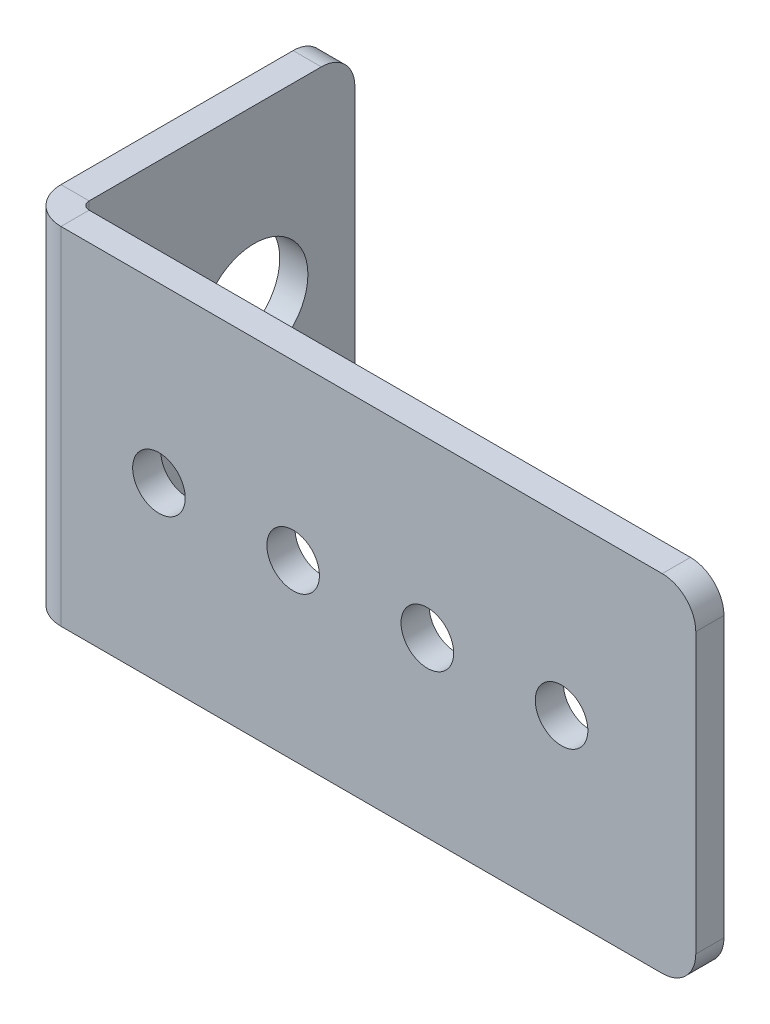
ISO-10303-21;
HEADER;
FILE_DESCRIPTION(('STEP AP214'),'2;1');
FILE_NAME('part.step','',(''),(''),'','','');
FILE_SCHEMA(('AUTOMOTIVE_DESIGN { 1 0 10303 214 1 1 1 1 }'));
ENDSEC;
DATA;
#1=APPLICATION_CONTEXT('core data for automotive mechanical design processes');
#2=APPLICATION_PROTOCOL_DEFINITION('international standard','automotive_design',2000,#1);
#3=PRODUCT_CONTEXT('',#1,'mechanical');
#4=PRODUCT('Part','Part','',(#3));
#5=PRODUCT_RELATED_PRODUCT_CATEGORY('part','',(#4));
#6=PRODUCT_DEFINITION_FORMATION('','',#4);
#7=PRODUCT_DEFINITION_CONTEXT('part definition',#1,'design');
#8=PRODUCT_DEFINITION('design','',#6,#7);
#9=PRODUCT_DEFINITION_SHAPE('','',#8);
#10=(LENGTH_UNIT() NAMED_UNIT(*) SI_UNIT(.MILLI.,.METRE.));
#11=(NAMED_UNIT(*) PLANE_ANGLE_UNIT() SI_UNIT($,.RADIAN.));
#12=(NAMED_UNIT(*) SI_UNIT($,.STERADIAN.) SOLID_ANGLE_UNIT());
#13=UNCERTAINTY_MEASURE_WITH_UNIT(LENGTH_MEASURE(1.E-05),#10,'distance_accuracy_value','');
#14=(GEOMETRIC_REPRESENTATION_CONTEXT(3) GLOBAL_UNCERTAINTY_ASSIGNED_CONTEXT((#13)) GLOBAL_UNIT_ASSIGNED_CONTEXT((#10,
#11,#12)) REPRESENTATION_CONTEXT('',''));
#15=CARTESIAN_POINT('',(0.,0.,0.));
#16=DIRECTION('',(0.,0.,1.));
#17=DIRECTION('',(1.,0.,0.));
#18=AXIS2_PLACEMENT_3D('',#15,#16,#17);
#19=CARTESIAN_POINT('',(0.,32.766,-3.429));
#20=DIRECTION('',(0.,1.,0.));
#21=DIRECTION('',(0.,0.,1.));
#22=AXIS2_PLACEMENT_3D('',#19,#20,#21);
#23=PLANE('',#22);
#24=DIRECTION('',(1.,0.,0.));
#25=VECTOR('',#24,1.);
#26=CARTESIAN_POINT('',(0.,32.766,-3.429));
#27=LINE('',#26,#25);
#28=CARTESIAN_POINT('',(0.,32.766,-3.429));
#29=VERTEX_POINT('',#28);
#30=CARTESIAN_POINT('',(2.667,32.766,-3.429));
#31=VERTEX_POINT('',#30);
#32=EDGE_CURVE('E146',#29,#31,#27,.T.);
#33=ORIENTED_EDGE('',*,*,#32,.F.);
#34=CARTESIAN_POINT('',(3.429,32.766,-3.429));
#35=DIRECTION('',(0.,-1.,0.));
#36=DIRECTION('',(0.,0.,-1.));
#37=AXIS2_PLACEMENT_3D('',#34,#35,#36);
#38=CIRCLE('',#37,3.429);
#39=CARTESIAN_POINT('',(3.429,32.766,0.));
#40=VERTEX_POINT('',#39);
#41=EDGE_CURVE('E141',#29,#40,#38,.F.);
#42=ORIENTED_EDGE('',*,*,#41,.T.);
#43=DIRECTION('',(0.,0.,1.));
#44=VECTOR('',#43,1.);
#45=CARTESIAN_POINT('',(3.429,32.766,-2.667));
#46=LINE('',#45,#44);
#47=CARTESIAN_POINT('',(3.429,32.766,-2.667));
#48=VERTEX_POINT('',#47);
#49=EDGE_CURVE('E135',#48,#40,#46,.T.);
#50=ORIENTED_EDGE('',*,*,#49,.F.);
#51=CARTESIAN_POINT('',(3.429,32.766,-3.429));
#52=DIRECTION('',(0.,1.,0.));
#53=DIRECTION('',(1.,0.,0.));
#54=AXIS2_PLACEMENT_3D('',#51,#52,#53);
#55=CIRCLE('',#54,0.762);
#56=EDGE_CURVE('E139',#31,#48,#55,.T.);
#57=ORIENTED_EDGE('',*,*,#56,.F.);
#58=EDGE_LOOP('',(#33,#42,#50,#57));
#59=FACE_BOUND('',#58,.T.);
#60=ADVANCED_FACE('F45',(#59),#23,.T.);
#61=CARTESIAN_POINT('',(3.429,32.766,-2.667));
#62=DIRECTION('',(0.,1.,0.));
#63=DIRECTION('',(0.,0.,1.));
#64=AXIS2_PLACEMENT_3D('',#61,#62,#63);
#65=PLANE('',#64);
#66=DIRECTION('',(0.,0.,-1.));
#67=VECTOR('',#66,1.);
#68=CARTESIAN_POINT('',(2.667,32.766,0.));
#69=LINE('',#68,#67);
#70=CARTESIAN_POINT('',(2.667,32.766,-25.4));
#71=VERTEX_POINT('',#70);
#72=EDGE_CURVE('E174',#71,#31,#69,.F.);
#73=ORIENTED_EDGE('',*,*,#72,.F.);
#74=DIRECTION('',(1.,0.,0.));
#75=VECTOR('',#74,1.);
#76=CARTESIAN_POINT('',(3.429,32.766,-25.4));
#77=LINE('',#76,#75);
#78=CARTESIAN_POINT('',(0.,32.766,-25.4));
#79=VERTEX_POINT('',#78);
#80=EDGE_CURVE('E11',#71,#79,#77,.F.);
#81=ORIENTED_EDGE('',*,*,#80,.T.);
#82=DIRECTION('',(0.,0.,1.));
#83=VECTOR('',#82,1.);
#84=CARTESIAN_POINT('',(0.,32.766,0.));
#85=LINE('',#84,#83);
#86=EDGE_CURVE('E176',#79,#29,#85,.T.);
#87=ORIENTED_EDGE('',*,*,#86,.T.);
#88=ORIENTED_EDGE('',*,*,#32,.T.);
#89=EDGE_LOOP('',(#73,#81,#87,#88));
#90=FACE_BOUND('',#89,.T.);
#91=ADVANCED_FACE('F265',(#90),#65,.T.);
#92=CARTESIAN_POINT('',(3.429,0.,0.));
#93=DIRECTION('',(0.,-1.,0.));
#94=DIRECTION('',(0.,0.,-1.));
#95=AXIS2_PLACEMENT_3D('',#92,#93,#94);
#96=PLANE('',#95);
#97=DIRECTION('',(0.,0.,-1.));
#98=VECTOR('',#97,1.);
#99=CARTESIAN_POINT('',(3.429,0.,0.));
#100=LINE('',#99,#98);
#101=CARTESIAN_POINT('',(3.429,0.,0.));
#102=VERTEX_POINT('',#101);
#103=CARTESIAN_POINT('',(3.429,0.,-2.667));
#104=VERTEX_POINT('',#103);
#105=EDGE_CURVE('E147',#102,#104,#100,.T.);
#106=ORIENTED_EDGE('',*,*,#105,.F.);
#107=CARTESIAN_POINT('',(3.429,0.,-3.429));
#108=DIRECTION('',(0.,-1.,0.));
#109=DIRECTION('',(0.,0.,-1.));
#110=AXIS2_PLACEMENT_3D('',#107,#108,#109);
#111=CIRCLE('',#110,3.429);
#112=CARTESIAN_POINT('',(0.,0.,-3.429));
#113=VERTEX_POINT('',#112);
#114=EDGE_CURVE('E194',#113,#102,#111,.F.);
#115=ORIENTED_EDGE('',*,*,#114,.F.);
#116=DIRECTION('',(-1.,0.,0.));
#117=VECTOR('',#116,1.);
#118=CARTESIAN_POINT('',(2.667,0.,-3.429));
#119=LINE('',#118,#117);
#120=CARTESIAN_POINT('',(2.667,0.,-3.429));
#121=VERTEX_POINT('',#120);
#122=EDGE_CURVE('E211',#121,#113,#119,.T.);
#123=ORIENTED_EDGE('',*,*,#122,.F.);
#124=CARTESIAN_POINT('',(3.429,0.,-3.429));
#125=DIRECTION('',(0.,1.,0.));
#126=DIRECTION('',(1.,0.,0.));
#127=AXIS2_PLACEMENT_3D('',#124,#125,#126);
#128=CIRCLE('',#127,0.762);
#129=EDGE_CURVE('E188',#121,#104,#128,.T.);
#130=ORIENTED_EDGE('',*,*,#129,.T.);
#131=EDGE_LOOP('',(#106,#115,#123,#130));
#132=FACE_BOUND('',#131,.T.);
#133=ADVANCED_FACE('F329',(#132),#96,.T.);
#134=CARTESIAN_POINT('',(2.667,0.,-3.429));
#135=DIRECTION('',(0.,-1.,0.));
#136=DIRECTION('',(0.,0.,-1.));
#137=AXIS2_PLACEMENT_3D('',#134,#135,#136);
#138=PLANE('',#137);
#139=DIRECTION('',(1.,0.,0.));
#140=VECTOR('',#139,1.);
#141=CARTESIAN_POINT('',(0.,0.,-2.667));
#142=LINE('',#141,#140);
#143=CARTESIAN_POINT('',(60.325,0.,-2.667));
#144=VERTEX_POINT('',#143);
#145=EDGE_CURVE('E159',#104,#144,#142,.T.);
#146=ORIENTED_EDGE('',*,*,#145,.T.);
#147=DIRECTION('',(0.,0.,1.));
#148=VECTOR('',#147,1.);
#149=CARTESIAN_POINT('',(60.325,0.,-3.429));
#150=LINE('',#149,#148);
#151=CARTESIAN_POINT('',(60.325,0.,0.));
#152=VERTEX_POINT('',#151);
#153=EDGE_CURVE('E217',#144,#152,#150,.T.);
#154=ORIENTED_EDGE('',*,*,#153,.T.);
#155=DIRECTION('',(1.,0.,0.));
#156=VECTOR('',#155,1.);
#157=CARTESIAN_POINT('',(0.,0.,0.));
#158=LINE('',#157,#156);
#159=EDGE_CURVE('E183',#102,#152,#158,.T.);
#160=ORIENTED_EDGE('',*,*,#159,.F.);
#161=ORIENTED_EDGE('',*,*,#105,.T.);
#162=EDGE_LOOP('',(#146,#154,#160,#161));
#163=FACE_BOUND('',#162,.T.);
#164=ADVANCED_FACE('F496',(#163),#138,.T.);
#165=CARTESIAN_POINT('',(0.,32.766,0.));
#166=DIRECTION('',(0.,0.,-1.));
#167=DIRECTION('',(-1.,0.,0.));
#168=AXIS2_PLACEMENT_3D('',#165,#166,#167);
#169=PLANE('',#168);
#170=CARTESIAN_POINT('',(50.8,16.383,0.));
#171=DIRECTION('',(0.,0.,-1.));
#172=DIRECTION('',(-1.,0.,0.));
#173=AXIS2_PLACEMENT_3D('',#170,#171,#172);
#174=CIRCLE('',#173,2.4892);
#175=CARTESIAN_POINT('',(48.3108,16.383,0.));
#176=VERTEX_POINT('',#175);
#177=EDGE_CURVE('E186',#176,#176,#174,.T.);
#178=ORIENTED_EDGE('',*,*,#177,.T.);
#179=EDGE_LOOP('',(#178));
#180=FACE_BOUND('',#179,.T.);
#181=CARTESIAN_POINT('',(38.1,16.383,0.));
#182=DIRECTION('',(0.,0.,-1.));
#183=DIRECTION('',(-1.,0.,0.));
#184=AXIS2_PLACEMENT_3D('',#181,#182,#183);
#185=CIRCLE('',#184,2.4892);
#186=CARTESIAN_POINT('',(35.6108,16.383,0.));
#187=VERTEX_POINT('',#186);
#188=EDGE_CURVE('E291',#187,#187,#185,.T.);
#189=ORIENTED_EDGE('',*,*,#188,.T.);
#190=EDGE_LOOP('',(#189));
#191=FACE_BOUND('',#190,.T.);
#192=CARTESIAN_POINT('',(25.4,16.383,0.));
#193=DIRECTION('',(0.,0.,-1.));
#194=DIRECTION('',(-1.,0.,0.));
#195=AXIS2_PLACEMENT_3D('',#192,#193,#194);
#196=CIRCLE('',#195,2.4892);
#197=CARTESIAN_POINT('',(22.9108,16.383,0.));
#198=VERTEX_POINT('',#197);
#199=EDGE_CURVE('E285',#198,#198,#196,.T.);
#200=ORIENTED_EDGE('',*,*,#199,.T.);
#201=EDGE_LOOP('',(#200));
#202=FACE_BOUND('',#201,.T.);
#203=CARTESIAN_POINT('',(12.7,16.383,0.));
#204=DIRECTION('',(0.,0.,-1.));
#205=DIRECTION('',(-1.,0.,0.));
#206=AXIS2_PLACEMENT_3D('',#203,#204,#205);
#207=CIRCLE('',#206,2.4892);
#208=CARTESIAN_POINT('',(10.2108,16.383,0.));
#209=VERTEX_POINT('',#208);
#210=EDGE_CURVE('E278',#209,#209,#207,.T.);
#211=ORIENTED_EDGE('',*,*,#210,.T.);
#212=EDGE_LOOP('',(#211));
#213=FACE_BOUND('',#212,.T.);
#214=ORIENTED_EDGE('',*,*,#159,.T.);
#215=CARTESIAN_POINT('',(60.325,3.175,0.));
#216=DIRECTION('',(0.,0.,-1.));
#217=DIRECTION('',(-1.,0.,0.));
#218=AXIS2_PLACEMENT_3D('',#215,#216,#217);
#219=CIRCLE('',#218,3.175);
#220=CARTESIAN_POINT('',(63.5,3.175,0.));
#221=VERTEX_POINT('',#220);
#222=EDGE_CURVE('E222',#152,#221,#219,.F.);
#223=ORIENTED_EDGE('',*,*,#222,.T.);
#224=DIRECTION('',(0.,-1.,0.));
#225=VECTOR('',#224,1.);
#226=CARTESIAN_POINT('',(63.5,32.766,0.));
#227=LINE('',#226,#225);
#228=CARTESIAN_POINT('',(63.5,29.591,0.));
#229=VERTEX_POINT('',#228);
#230=EDGE_CURVE('E208',#229,#221,#227,.T.);
#231=ORIENTED_EDGE('',*,*,#230,.F.);
#232=CARTESIAN_POINT('',(60.325,29.591,0.));
#233=DIRECTION('',(0.,0.,-1.));
#234=DIRECTION('',(-1.,0.,0.));
#235=AXIS2_PLACEMENT_3D('',#232,#233,#234);
#236=CIRCLE('',#235,3.175);
#237=CARTESIAN_POINT('',(60.325,32.766,0.));
#238=VERTEX_POINT('',#237);
#239=EDGE_CURVE('E220',#229,#238,#236,.F.);
#240=ORIENTED_EDGE('',*,*,#239,.T.);
#241=DIRECTION('',(1.,0.,0.));
#242=VECTOR('',#241,1.);
#243=CARTESIAN_POINT('',(0.,32.766,0.));
#244=LINE('',#243,#242);
#245=EDGE_CURVE('E169',#40,#238,#244,.T.);
#246=ORIENTED_EDGE('',*,*,#245,.F.);
#247=DIRECTION('',(0.,-1.,0.));
#248=VECTOR('',#247,1.);
#249=CARTESIAN_POINT('',(3.429,32.766,0.));
#250=LINE('',#249,#248);
#251=EDGE_CURVE('E182',#40,#102,#250,.T.);
#252=ORIENTED_EDGE('',*,*,#251,.T.);
#253=EDGE_LOOP('',(#214,#223,#231,#240,#246,#252));
#254=FACE_BOUND('',#253,.T.);
#255=ADVANCED_FACE('F272',(#180,#191,#202,#213,#254),#169,.F.);
#256=CARTESIAN_POINT('',(63.5,32.766,-2.667));
#257=DIRECTION('',(1.,0.,0.));
#258=DIRECTION('',(0.,0.,-1.));
#259=AXIS2_PLACEMENT_3D('',#256,#257,#258);
#260=PLANE('',#259);
#261=ORIENTED_EDGE('',*,*,#230,.T.);
#262=DIRECTION('',(0.,0.,1.));
#263=VECTOR('',#262,1.);
#264=CARTESIAN_POINT('',(63.5,3.175,-2.667));
#265=LINE('',#264,#263);
#266=CARTESIAN_POINT('',(63.5,3.175,-2.667));
#267=VERTEX_POINT('',#266);
#268=EDGE_CURVE('E227',#221,#267,#265,.F.);
#269=ORIENTED_EDGE('',*,*,#268,.T.);
#270=DIRECTION('',(0.,-1.,0.));
#271=VECTOR('',#270,1.);
#272=CARTESIAN_POINT('',(63.5,32.766,-2.667));
#273=LINE('',#272,#271);
#274=CARTESIAN_POINT('',(63.5,29.591,-2.667));
#275=VERTEX_POINT('',#274);
#276=EDGE_CURVE('E163',#275,#267,#273,.T.);
#277=ORIENTED_EDGE('',*,*,#276,.F.);
#278=DIRECTION('',(0.,0.,1.));
#279=VECTOR('',#278,1.);
#280=CARTESIAN_POINT('',(63.5,29.591,-2.667));
#281=LINE('',#280,#279);
#282=EDGE_CURVE('E224',#275,#229,#281,.T.);
#283=ORIENTED_EDGE('',*,*,#282,.T.);
#284=EDGE_LOOP('',(#261,#269,#277,#283));
#285=FACE_BOUND('',#284,.T.);
#286=ADVANCED_FACE('F475',(#285),#260,.T.);
#287=CARTESIAN_POINT('',(0.,32.766,-2.667));
#288=DIRECTION('',(0.,0.,-1.));
#289=DIRECTION('',(-1.,0.,0.));
#290=AXIS2_PLACEMENT_3D('',#287,#288,#289);
#291=PLANE('',#290);
#292=CARTESIAN_POINT('',(50.8,16.383,-2.667));
#293=DIRECTION('',(0.,0.,-1.));
#294=DIRECTION('',(-1.,0.,0.));
#295=AXIS2_PLACEMENT_3D('',#292,#293,#294);
#296=CIRCLE('',#295,2.4892);
#297=CARTESIAN_POINT('',(48.3108,16.383,-2.667));
#298=VERTEX_POINT('',#297);
#299=EDGE_CURVE('E294',#298,#298,#296,.T.);
#300=ORIENTED_EDGE('',*,*,#299,.F.);
#301=EDGE_LOOP('',(#300));
#302=FACE_BOUND('',#301,.T.);
#303=CARTESIAN_POINT('',(38.1,16.383,-2.667));
#304=DIRECTION('',(0.,0.,-1.));
#305=DIRECTION('',(-1.,0.,0.));
#306=AXIS2_PLACEMENT_3D('',#303,#304,#305);
#307=CIRCLE('',#306,2.4892);
#308=CARTESIAN_POINT('',(35.6108,16.383,-2.667));
#309=VERTEX_POINT('',#308);
#310=EDGE_CURVE('E288',#309,#309,#307,.T.);
#311=ORIENTED_EDGE('',*,*,#310,.F.);
#312=EDGE_LOOP('',(#311));
#313=FACE_BOUND('',#312,.T.);
#314=CARTESIAN_POINT('',(25.4,16.383,-2.667));
#315=DIRECTION('',(0.,0.,-1.));
#316=DIRECTION('',(-1.,0.,0.));
#317=AXIS2_PLACEMENT_3D('',#314,#315,#316);
#318=CIRCLE('',#317,2.4892);
#319=CARTESIAN_POINT('',(22.9108,16.383,-2.667));
#320=VERTEX_POINT('',#319);
#321=EDGE_CURVE('E282',#320,#320,#318,.T.);
#322=ORIENTED_EDGE('',*,*,#321,.F.);
#323=EDGE_LOOP('',(#322));
#324=FACE_BOUND('',#323,.T.);
#325=CARTESIAN_POINT('',(12.7,16.383,-2.667));
#326=DIRECTION('',(0.,0.,-1.));
#327=DIRECTION('',(-1.,0.,0.));
#328=AXIS2_PLACEMENT_3D('',#325,#326,#327);
#329=CIRCLE('',#328,2.4892);
#330=CARTESIAN_POINT('',(10.2108,16.383,-2.667));
#331=VERTEX_POINT('',#330);
#332=EDGE_CURVE('E275',#331,#331,#329,.T.);
#333=ORIENTED_EDGE('',*,*,#332,.F.);
#334=EDGE_LOOP('',(#333));
#335=FACE_BOUND('',#334,.T.);
#336=ORIENTED_EDGE('',*,*,#276,.T.);
#337=CARTESIAN_POINT('',(60.325,3.175,-2.667));
#338=DIRECTION('',(0.,0.,-1.));
#339=DIRECTION('',(-1.,0.,0.));
#340=AXIS2_PLACEMENT_3D('',#337,#338,#339);
#341=CIRCLE('',#340,3.175);
#342=EDGE_CURVE('E231',#267,#144,#341,.T.);
#343=ORIENTED_EDGE('',*,*,#342,.T.);
#344=ORIENTED_EDGE('',*,*,#145,.F.);
#345=DIRECTION('',(0.,-1.,0.));
#346=VECTOR('',#345,1.);
#347=CARTESIAN_POINT('',(3.429,32.766,-2.667));
#348=LINE('',#347,#346);
#349=EDGE_CURVE('E153',#48,#104,#348,.T.);
#350=ORIENTED_EDGE('',*,*,#349,.F.);
#351=DIRECTION('',(1.,0.,0.));
#352=VECTOR('',#351,1.);
#353=CARTESIAN_POINT('',(0.,32.766,-2.667));
#354=LINE('',#353,#352);
#355=CARTESIAN_POINT('',(60.325,32.766,-2.667));
#356=VERTEX_POINT('',#355);
#357=EDGE_CURVE('E156',#48,#356,#354,.T.);
#358=ORIENTED_EDGE('',*,*,#357,.T.);
#359=CARTESIAN_POINT('',(60.325,29.591,-2.667));
#360=DIRECTION('',(0.,0.,-1.));
#361=DIRECTION('',(-1.,0.,0.));
#362=AXIS2_PLACEMENT_3D('',#359,#360,#361);
#363=CIRCLE('',#362,3.175);
#364=EDGE_CURVE('E229',#356,#275,#363,.T.);
#365=ORIENTED_EDGE('',*,*,#364,.T.);
#366=EDGE_LOOP('',(#336,#343,#344,#350,#358,#365));
#367=FACE_BOUND('',#366,.T.);
#368=ADVANCED_FACE('F155',(#302,#313,#324,#335,#367),#291,.T.);
#369=CARTESIAN_POINT('',(3.429,32.766,-3.429));
#370=DIRECTION('',(0.,-1.,0.));
#371=DIRECTION('',(0.,0.,-1.));
#372=AXIS2_PLACEMENT_3D('',#369,#370,#371);
#373=CYLINDRICAL_SURFACE('',#372,0.762);
#374=ORIENTED_EDGE('',*,*,#129,.F.);
#375=DIRECTION('',(0.,-1.,0.));
#376=VECTOR('',#375,1.);
#377=CARTESIAN_POINT('',(2.667,32.766,-3.429));
#378=LINE('',#377,#376);
#379=EDGE_CURVE('E164',#31,#121,#378,.T.);
#380=ORIENTED_EDGE('',*,*,#379,.F.);
#381=ORIENTED_EDGE('',*,*,#56,.T.);
#382=ORIENTED_EDGE('',*,*,#349,.T.);
#383=EDGE_LOOP('',(#374,#380,#381,#382));
#384=FACE_BOUND('',#383,.T.);
#385=ADVANCED_FACE('F172',(#384),#373,.F.);
#386=CARTESIAN_POINT('',(2.667,32.766,0.));
#387=DIRECTION('',(1.,0.,0.));
#388=DIRECTION('',(0.,0.,-1.));
#389=AXIS2_PLACEMENT_3D('',#386,#387,#388);
#390=PLANE('',#389);
#391=CARTESIAN_POINT('',(2.667,16.383,-19.05));
#392=DIRECTION('',(1.,0.,0.));
#393=DIRECTION('',(0.,0.,-1.));
#394=AXIS2_PLACEMENT_3D('',#391,#392,#393);
#395=CIRCLE('',#394,5.08);
#396=CARTESIAN_POINT('',(2.667,16.383,-24.13));
#397=VERTEX_POINT('',#396);
#398=EDGE_CURVE('E299',#397,#397,#395,.T.);
#399=ORIENTED_EDGE('',*,*,#398,.F.);
#400=EDGE_LOOP('',(#399));
#401=FACE_BOUND('',#400,.T.);
#402=DIRECTION('',(0.,0.,-1.));
#403=VECTOR('',#402,1.);
#404=CARTESIAN_POINT('',(2.667,0.,0.));
#405=LINE('',#404,#403);
#406=CARTESIAN_POINT('',(2.667,0.,-25.4));
#407=VERTEX_POINT('',#406);
#408=EDGE_CURVE('E190',#407,#121,#405,.F.);
#409=ORIENTED_EDGE('',*,*,#408,.F.);
#410=CARTESIAN_POINT('',(2.667,3.175,-25.4));
#411=DIRECTION('',(1.,0.,0.));
#412=DIRECTION('',(0.,0.,-1.));
#413=AXIS2_PLACEMENT_3D('',#410,#411,#412);
#414=CIRCLE('',#413,3.175);
#415=CARTESIAN_POINT('',(2.667,3.175,-28.575));
#416=VERTEX_POINT('',#415);
#417=EDGE_CURVE('E239',#407,#416,#414,.T.);
#418=ORIENTED_EDGE('',*,*,#417,.T.);
#419=DIRECTION('',(0.,-1.,0.));
#420=VECTOR('',#419,1.);
#421=CARTESIAN_POINT('',(2.667,32.766,-28.575));
#422=LINE('',#421,#420);
#423=CARTESIAN_POINT('',(2.667,29.591,-28.575));
#424=VERTEX_POINT('',#423);
#425=EDGE_CURVE('E204',#424,#416,#422,.T.);
#426=ORIENTED_EDGE('',*,*,#425,.F.);
#427=CARTESIAN_POINT('',(2.667,29.591,-25.4));
#428=DIRECTION('',(1.,0.,0.));
#429=DIRECTION('',(0.,0.,-1.));
#430=AXIS2_PLACEMENT_3D('',#427,#428,#429);
#431=CIRCLE('',#430,3.175);
#432=EDGE_CURVE('E237',#424,#71,#431,.T.);
#433=ORIENTED_EDGE('',*,*,#432,.T.);
#434=ORIENTED_EDGE('',*,*,#72,.T.);
#435=ORIENTED_EDGE('',*,*,#379,.T.);
#436=EDGE_LOOP('',(#409,#418,#426,#433,#434,#435));
#437=FACE_BOUND('',#436,.T.);
#438=ADVANCED_FACE('F260',(#401,#437),#390,.T.);
#439=CARTESIAN_POINT('',(0.,32.766,-28.575));
#440=DIRECTION('',(0.,0.,-1.));
#441=DIRECTION('',(-1.,0.,0.));
#442=AXIS2_PLACEMENT_3D('',#439,#440,#441);
#443=PLANE('',#442);
#444=ORIENTED_EDGE('',*,*,#425,.T.);
#445=DIRECTION('',(1.,0.,0.));
#446=VECTOR('',#445,1.);
#447=CARTESIAN_POINT('',(0.,3.175,-28.575));
#448=LINE('',#447,#446);
#449=CARTESIAN_POINT('',(0.,3.175,-28.575));
#450=VERTEX_POINT('',#449);
#451=EDGE_CURVE('E66',#416,#450,#448,.F.);
#452=ORIENTED_EDGE('',*,*,#451,.T.);
#453=DIRECTION('',(0.,-1.,0.));
#454=VECTOR('',#453,1.);
#455=CARTESIAN_POINT('',(0.,32.766,-28.575));
#456=LINE('',#455,#454);
#457=CARTESIAN_POINT('',(0.,29.591,-28.575));
#458=VERTEX_POINT('',#457);
#459=EDGE_CURVE('E202',#458,#450,#456,.T.);
#460=ORIENTED_EDGE('',*,*,#459,.F.);
#461=DIRECTION('',(1.,0.,0.));
#462=VECTOR('',#461,1.);
#463=CARTESIAN_POINT('',(0.,29.591,-28.575));
#464=LINE('',#463,#462);
#465=EDGE_CURVE('E241',#458,#424,#464,.T.);
#466=ORIENTED_EDGE('',*,*,#465,.T.);
#467=EDGE_LOOP('',(#444,#452,#460,#466));
#468=FACE_BOUND('',#467,.T.);
#469=ADVANCED_FACE('F261',(#468),#443,.T.);
#470=CARTESIAN_POINT('',(0.,32.766,0.));
#471=DIRECTION('',(1.,0.,0.));
#472=DIRECTION('',(0.,0.,-1.));
#473=AXIS2_PLACEMENT_3D('',#470,#471,#472);
#474=PLANE('',#473);
#475=CARTESIAN_POINT('',(0.,16.383,-19.05));
#476=DIRECTION('',(1.,0.,0.));
#477=DIRECTION('',(0.,0.,-1.));
#478=AXIS2_PLACEMENT_3D('',#475,#476,#477);
#479=CIRCLE('',#478,5.08);
#480=CARTESIAN_POINT('',(0.,16.383,-24.13));
#481=VERTEX_POINT('',#480);
#482=EDGE_CURVE('E279',#481,#481,#479,.T.);
#483=ORIENTED_EDGE('',*,*,#482,.T.);
#484=EDGE_LOOP('',(#483));
#485=FACE_BOUND('',#484,.T.);
#486=ORIENTED_EDGE('',*,*,#459,.T.);
#487=CARTESIAN_POINT('',(0.,3.175,-25.4));
#488=DIRECTION('',(1.,0.,0.));
#489=DIRECTION('',(0.,0.,-1.));
#490=AXIS2_PLACEMENT_3D('',#487,#488,#489);
#491=CIRCLE('',#490,3.175);
#492=CARTESIAN_POINT('',(0.,0.,-25.4));
#493=VERTEX_POINT('',#492);
#494=EDGE_CURVE('E53',#450,#493,#491,.F.);
#495=ORIENTED_EDGE('',*,*,#494,.T.);
#496=DIRECTION('',(0.,0.,1.));
#497=VECTOR('',#496,1.);
#498=CARTESIAN_POINT('',(0.,0.,0.));
#499=LINE('',#498,#497);
#500=EDGE_CURVE('E192',#493,#113,#499,.T.);
#501=ORIENTED_EDGE('',*,*,#500,.T.);
#502=DIRECTION('',(0.,-1.,0.));
#503=VECTOR('',#502,1.);
#504=CARTESIAN_POINT('',(0.,32.766,-3.429));
#505=LINE('',#504,#503);
#506=EDGE_CURVE('E199',#29,#113,#505,.T.);
#507=ORIENTED_EDGE('',*,*,#506,.F.);
#508=ORIENTED_EDGE('',*,*,#86,.F.);
#509=CARTESIAN_POINT('',(0.,29.591,-25.4));
#510=DIRECTION('',(1.,0.,0.));
#511=DIRECTION('',(0.,0.,-1.));
#512=AXIS2_PLACEMENT_3D('',#509,#510,#511);
#513=CIRCLE('',#512,3.175);
#514=EDGE_CURVE('E245',#79,#458,#513,.F.);
#515=ORIENTED_EDGE('',*,*,#514,.T.);
#516=EDGE_LOOP('',(#486,#495,#501,#507,#508,#515));
#517=FACE_BOUND('',#516,.T.);
#518=ADVANCED_FACE('F249',(#485,#517),#474,.F.);
#519=CARTESIAN_POINT('',(3.429,32.766,-3.429));
#520=DIRECTION('',(0.,-1.,0.));
#521=DIRECTION('',(0.,0.,-1.));
#522=AXIS2_PLACEMENT_3D('',#519,#520,#521);
#523=CYLINDRICAL_SURFACE('',#522,3.429);
#524=ORIENTED_EDGE('',*,*,#114,.T.);
#525=ORIENTED_EDGE('',*,*,#251,.F.);
#526=ORIENTED_EDGE('',*,*,#41,.F.);
#527=ORIENTED_EDGE('',*,*,#506,.T.);
#528=EDGE_LOOP('',(#524,#525,#526,#527));
#529=FACE_BOUND('',#528,.T.);
#530=ADVANCED_FACE('F268',(#529),#523,.T.);
#531=CARTESIAN_POINT('',(3.429,32.766,-3.429));
#532=DIRECTION('',(0.,1.,0.));
#533=DIRECTION('',(1.,0.,0.));
#534=AXIS2_PLACEMENT_3D('',#531,#532,#533);
#535=PLANE('',#534);
#536=ORIENTED_EDGE('',*,*,#245,.T.);
#537=DIRECTION('',(0.,0.,1.));
#538=VECTOR('',#537,1.);
#539=CARTESIAN_POINT('',(60.325,32.766,-3.429));
#540=LINE('',#539,#538);
#541=EDGE_CURVE('E168',#238,#356,#540,.F.);
#542=ORIENTED_EDGE('',*,*,#541,.T.);
#543=ORIENTED_EDGE('',*,*,#357,.F.);
#544=ORIENTED_EDGE('',*,*,#49,.T.);
#545=EDGE_LOOP('',(#536,#542,#543,#544));
#546=FACE_BOUND('',#545,.T.);
#547=ADVANCED_FACE('F166',(#546),#535,.T.);
#548=CARTESIAN_POINT('',(3.429,0.,-3.429));
#549=DIRECTION('',(0.,1.,0.));
#550=DIRECTION('',(1.,0.,0.));
#551=AXIS2_PLACEMENT_3D('',#548,#549,#550);
#552=PLANE('',#551);
#553=ORIENTED_EDGE('',*,*,#500,.F.);
#554=DIRECTION('',(1.,0.,0.));
#555=VECTOR('',#554,1.);
#556=CARTESIAN_POINT('',(2.667,0.,-25.4));
#557=LINE('',#556,#555);
#558=EDGE_CURVE('E234',#493,#407,#557,.T.);
#559=ORIENTED_EDGE('',*,*,#558,.T.);
#560=ORIENTED_EDGE('',*,*,#408,.T.);
#561=ORIENTED_EDGE('',*,*,#122,.T.);
#562=EDGE_LOOP('',(#553,#559,#560,#561));
#563=FACE_BOUND('',#562,.T.);
#564=ADVANCED_FACE('F254',(#563),#552,.F.);
#565=CARTESIAN_POINT('',(12.7,16.383,0.));
#566=DIRECTION('',(0.,0.,-1.));
#567=DIRECTION('',(-1.,0.,0.));
#568=AXIS2_PLACEMENT_3D('',#565,#566,#567);
#569=CYLINDRICAL_SURFACE('',#568,2.4892);
#570=ORIENTED_EDGE('',*,*,#210,.F.);
#571=EDGE_LOOP('',(#570));
#572=FACE_BOUND('',#571,.T.);
#573=ORIENTED_EDGE('',*,*,#332,.T.);
#574=EDGE_LOOP('',(#573));
#575=FACE_BOUND('',#574,.T.);
#576=ADVANCED_FACE('F401',(#572,#575),#569,.F.);
#577=CARTESIAN_POINT('',(25.4,16.383,0.));
#578=DIRECTION('',(0.,0.,-1.));
#579=DIRECTION('',(-1.,0.,0.));
#580=AXIS2_PLACEMENT_3D('',#577,#578,#579);
#581=CYLINDRICAL_SURFACE('',#580,2.4892);
#582=ORIENTED_EDGE('',*,*,#199,.F.);
#583=EDGE_LOOP('',(#582));
#584=FACE_BOUND('',#583,.T.);
#585=ORIENTED_EDGE('',*,*,#321,.T.);
#586=EDGE_LOOP('',(#585));
#587=FACE_BOUND('',#586,.T.);
#588=ADVANCED_FACE('F390',(#584,#587),#581,.F.);
#589=CARTESIAN_POINT('',(38.1,16.383,0.));
#590=DIRECTION('',(0.,0.,-1.));
#591=DIRECTION('',(-1.,0.,0.));
#592=AXIS2_PLACEMENT_3D('',#589,#590,#591);
#593=CYLINDRICAL_SURFACE('',#592,2.4892);
#594=ORIENTED_EDGE('',*,*,#188,.F.);
#595=EDGE_LOOP('',(#594));
#596=FACE_BOUND('',#595,.T.);
#597=ORIENTED_EDGE('',*,*,#310,.T.);
#598=EDGE_LOOP('',(#597));
#599=FACE_BOUND('',#598,.T.);
#600=ADVANCED_FACE('F379',(#596,#599),#593,.F.);
#601=CARTESIAN_POINT('',(50.8,16.383,0.));
#602=DIRECTION('',(0.,0.,-1.));
#603=DIRECTION('',(-1.,0.,0.));
#604=AXIS2_PLACEMENT_3D('',#601,#602,#603);
#605=CYLINDRICAL_SURFACE('',#604,2.4892);
#606=ORIENTED_EDGE('',*,*,#177,.F.);
#607=EDGE_LOOP('',(#606));
#608=FACE_BOUND('',#607,.T.);
#609=ORIENTED_EDGE('',*,*,#299,.T.);
#610=EDGE_LOOP('',(#609));
#611=FACE_BOUND('',#610,.T.);
#612=ADVANCED_FACE('F310',(#608,#611),#605,.F.);
#613=CARTESIAN_POINT('',(0.,16.383,-19.05));
#614=DIRECTION('',(1.,0.,0.));
#615=DIRECTION('',(0.,0.,-1.));
#616=AXIS2_PLACEMENT_3D('',#613,#614,#615);
#617=CYLINDRICAL_SURFACE('',#616,5.08);
#618=ORIENTED_EDGE('',*,*,#482,.F.);
#619=EDGE_LOOP('',(#618));
#620=FACE_BOUND('',#619,.T.);
#621=ORIENTED_EDGE('',*,*,#398,.T.);
#622=EDGE_LOOP('',(#621));
#623=FACE_BOUND('',#622,.T.);
#624=ADVANCED_FACE('F306',(#620,#623),#617,.F.);
#625=CARTESIAN_POINT('',(60.325,3.175,-3.429));
#626=DIRECTION('',(0.,0.,1.));
#627=DIRECTION('',(1.,0.,0.));
#628=AXIS2_PLACEMENT_3D('',#625,#626,#627);
#629=CYLINDRICAL_SURFACE('',#628,3.175);
#630=ORIENTED_EDGE('',*,*,#342,.F.);
#631=ORIENTED_EDGE('',*,*,#268,.F.);
#632=ORIENTED_EDGE('',*,*,#222,.F.);
#633=ORIENTED_EDGE('',*,*,#153,.F.);
#634=EDGE_LOOP('',(#630,#631,#632,#633));
#635=FACE_BOUND('',#634,.T.);
#636=ADVANCED_FACE('F309',(#635),#629,.T.);
#637=CARTESIAN_POINT('',(60.325,29.591,-2.667));
#638=DIRECTION('',(0.,0.,1.));
#639=DIRECTION('',(1.,0.,0.));
#640=AXIS2_PLACEMENT_3D('',#637,#638,#639);
#641=CYLINDRICAL_SURFACE('',#640,3.175);
#642=ORIENTED_EDGE('',*,*,#364,.F.);
#643=ORIENTED_EDGE('',*,*,#541,.F.);
#644=ORIENTED_EDGE('',*,*,#239,.F.);
#645=ORIENTED_EDGE('',*,*,#282,.F.);
#646=EDGE_LOOP('',(#642,#643,#644,#645));
#647=FACE_BOUND('',#646,.T.);
#648=ADVANCED_FACE('F335',(#647),#641,.T.);
#649=CARTESIAN_POINT('',(3.429,3.175,-25.4));
#650=DIRECTION('',(-1.,0.,0.));
#651=DIRECTION('',(0.,0.,1.));
#652=AXIS2_PLACEMENT_3D('',#649,#650,#651);
#653=CYLINDRICAL_SURFACE('',#652,3.175);
#654=ORIENTED_EDGE('',*,*,#494,.F.);
#655=ORIENTED_EDGE('',*,*,#451,.F.);
#656=ORIENTED_EDGE('',*,*,#417,.F.);
#657=ORIENTED_EDGE('',*,*,#558,.F.);
#658=EDGE_LOOP('',(#654,#655,#656,#657));
#659=FACE_BOUND('',#658,.T.);
#660=ADVANCED_FACE('F257',(#659),#653,.T.);
#661=CARTESIAN_POINT('',(0.,29.591,-25.4));
#662=DIRECTION('',(1.,0.,0.));
#663=DIRECTION('',(0.,0.,-1.));
#664=AXIS2_PLACEMENT_3D('',#661,#662,#663);
#665=CYLINDRICAL_SURFACE('',#664,3.175);
#666=ORIENTED_EDGE('',*,*,#514,.F.);
#667=ORIENTED_EDGE('',*,*,#80,.F.);
#668=ORIENTED_EDGE('',*,*,#432,.F.);
#669=ORIENTED_EDGE('',*,*,#465,.F.);
#670=EDGE_LOOP('',(#666,#667,#668,#669));
#671=FACE_BOUND('',#670,.T.);
#672=ADVANCED_FACE('F47',(#671),#665,.T.);
#673=CLOSED_SHELL('',(#60,#91,#133,#164,#255,#286,#368,#385,#438,#469,#518,#530,#547,#564,#576,
#588,#600,#612,#624,#636,#648,#660,#672));
#674=MANIFOLD_SOLID_BREP('B2',#673);
#675=ADVANCED_BREP_SHAPE_REPRESENTATION('',(#18,#674),#14);
#676=SHAPE_DEFINITION_REPRESENTATION(#9,#675);
ENDSEC;
END-ISO-10303-21;
